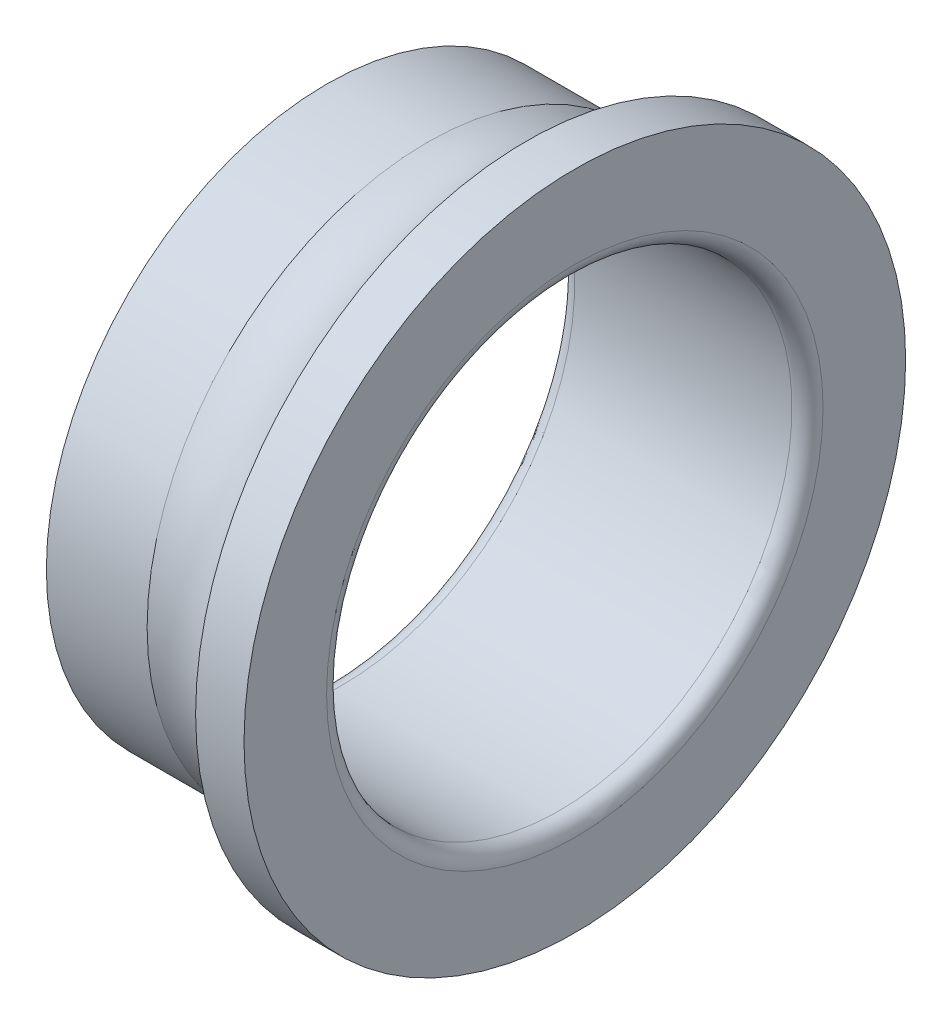
ISO-10303-21;
HEADER;
FILE_DESCRIPTION(('STEP AP214'),'2;1');
FILE_NAME('part.step','',(''),(''),'','','');
FILE_SCHEMA(('AUTOMOTIVE_DESIGN { 1 0 10303 214 1 1 1 1 }'));
ENDSEC;
DATA;
#1=APPLICATION_CONTEXT('core data for automotive mechanical design processes');
#2=APPLICATION_PROTOCOL_DEFINITION('international standard','automotive_design',2000,#1);
#3=PRODUCT_CONTEXT('',#1,'mechanical');
#4=PRODUCT('Part','Part','',(#3));
#5=PRODUCT_RELATED_PRODUCT_CATEGORY('part','',(#4));
#6=PRODUCT_DEFINITION_FORMATION('','',#4);
#7=PRODUCT_DEFINITION_CONTEXT('part definition',#1,'design');
#8=PRODUCT_DEFINITION('design','',#6,#7);
#9=PRODUCT_DEFINITION_SHAPE('','',#8);
#10=(LENGTH_UNIT() NAMED_UNIT(*) SI_UNIT(.MILLI.,.METRE.));
#11=(NAMED_UNIT(*) PLANE_ANGLE_UNIT() SI_UNIT($,.RADIAN.));
#12=(NAMED_UNIT(*) SI_UNIT($,.STERADIAN.) SOLID_ANGLE_UNIT());
#13=UNCERTAINTY_MEASURE_WITH_UNIT(LENGTH_MEASURE(1.E-05),#10,'distance_accuracy_value','');
#14=(GEOMETRIC_REPRESENTATION_CONTEXT(3) GLOBAL_UNCERTAINTY_ASSIGNED_CONTEXT((#13)) GLOBAL_UNIT_ASSIGNED_CONTEXT((#10,
#11,#12)) REPRESENTATION_CONTEXT('',''));
#15=CARTESIAN_POINT('',(0.,0.,0.));
#16=DIRECTION('',(0.,0.,1.));
#17=DIRECTION('',(1.,0.,0.));
#18=AXIS2_PLACEMENT_3D('',#15,#16,#17);
#19=CARTESIAN_POINT('',(0.,-18.4005816497134,-18.065));
#20=DIRECTION('',(-1.,0.,0.));
#21=DIRECTION('',(0.,0.,1.));
#22=AXIS2_PLACEMENT_3D('',#19,#20,#21);
#23=PLANE('',#22);
#24=CARTESIAN_POINT('',(0.,0.,0.));
#25=DIRECTION('',(-1.,0.,0.));
#26=DIRECTION('',(0.,0.,-1.));
#27=AXIS2_PLACEMENT_3D('',#24,#25,#26);
#28=CIRCLE('',#27,18.065);
#29=CARTESIAN_POINT('',(0.,0.,-18.065));
#30=VERTEX_POINT('',#29);
#31=EDGE_CURVE('E43',#30,#30,#28,.F.);
#32=ORIENTED_EDGE('',*,*,#31,.F.);
#33=EDGE_LOOP('',(#32));
#34=FACE_BOUND('',#33,.T.);
#35=CARTESIAN_POINT('',(0.,0.,0.));
#36=DIRECTION('',(1.,0.,0.));
#37=DIRECTION('',(0.,0.,1.));
#38=AXIS2_PLACEMENT_3D('',#35,#36,#37);
#39=CIRCLE('',#38,15.9999999999992);
#40=CARTESIAN_POINT('',(0.,0.,15.9999999999992));
#41=VERTEX_POINT('',#40);
#42=EDGE_CURVE('E40',#41,#41,#39,.T.);
#43=ORIENTED_EDGE('',*,*,#42,.T.);
#44=EDGE_LOOP('',(#43));
#45=FACE_BOUND('',#44,.T.);
#46=ADVANCED_FACE('F14',(#34,#45),#23,.T.);
#47=CARTESIAN_POINT('',(16.,-21.7211404932159,21.325));
#48=DIRECTION('',(1.,0.,0.));
#49=DIRECTION('',(0.,0.,-1.));
#50=AXIS2_PLACEMENT_3D('',#47,#48,#49);
#51=PLANE('',#50);
#52=CARTESIAN_POINT('',(16.,0.,0.));
#53=DIRECTION('',(1.,0.,0.));
#54=DIRECTION('',(0.,-1.16844179766066E-09,1.));
#55=AXIS2_PLACEMENT_3D('',#52,#53,#54);
#56=CIRCLE('',#55,21.325);
#57=CARTESIAN_POINT('',(16.,-2.49170213351135E-08,21.325));
#58=VERTEX_POINT('',#57);
#59=EDGE_CURVE('E37',#58,#58,#56,.T.);
#60=ORIENTED_EDGE('',*,*,#59,.T.);
#61=EDGE_LOOP('',(#60));
#62=FACE_BOUND('',#61,.T.);
#63=CARTESIAN_POINT('',(16.,0.,0.));
#64=DIRECTION('',(-1.,0.,0.));
#65=DIRECTION('',(0.,0.,-1.));
#66=AXIS2_PLACEMENT_3D('',#63,#64,#65);
#67=CIRCLE('',#66,16.0000000394232);
#68=CARTESIAN_POINT('',(16.,0.,-16.0000000394232));
#69=VERTEX_POINT('',#68);
#70=EDGE_CURVE('E34',#69,#69,#67,.F.);
#71=ORIENTED_EDGE('',*,*,#70,.F.);
#72=EDGE_LOOP('',(#71));
#73=FACE_BOUND('',#72,.T.);
#74=ADVANCED_FACE('F52',(#62,#73),#51,.T.);
#75=CARTESIAN_POINT('',(16.,0.,0.));
#76=DIRECTION('',(1.,0.,0.));
#77=DIRECTION('',(0.,1.92343596945729E-10,1.));
#78=AXIS2_PLACEMENT_3D('',#75,#76,#77);
#79=CYLINDRICAL_SURFACE('',#78,18.065);
#80=ORIENTED_EDGE('',*,*,#31,.T.);
#81=EDGE_LOOP('',(#80));
#82=FACE_BOUND('',#81,.T.);
#83=CARTESIAN_POINT('',(6.4946046200416,0.,0.));
#84=DIRECTION('',(-1.,0.,0.));
#85=DIRECTION('',(0.,0.,-1.));
#86=AXIS2_PLACEMENT_3D('',#83,#84,#85);
#87=CIRCLE('',#86,18.065);
#88=CARTESIAN_POINT('',(6.4946046200416,0.,-18.065));
#89=VERTEX_POINT('',#88);
#90=EDGE_CURVE('E29',#89,#89,#87,.F.);
#91=ORIENTED_EDGE('',*,*,#90,.F.);
#92=EDGE_LOOP('',(#91));
#93=FACE_BOUND('',#92,.T.);
#94=ADVANCED_FACE('F47',(#82,#93),#79,.T.);
#95=CARTESIAN_POINT('',(0.999999999999222,0.,0.));
#96=DIRECTION('',(1.,0.,0.));
#97=DIRECTION('',(0.,0.,1.));
#98=AXIS2_PLACEMENT_3D('',#95,#96,#97);
#99=TOROIDAL_SURFACE('',#98,15.9999999999992,0.999999999999222);
#100=CARTESIAN_POINT('',(1.,0.,0.));
#101=DIRECTION('',(1.,0.,0.));
#102=DIRECTION('',(0.,0.,1.));
#103=AXIS2_PLACEMENT_3D('',#100,#101,#102);
#104=CIRCLE('',#103,15.);
#105=CARTESIAN_POINT('',(1.,0.,15.));
#106=VERTEX_POINT('',#105);
#107=EDGE_CURVE('E25',#106,#106,#104,.T.);
#108=ORIENTED_EDGE('',*,*,#107,.T.);
#109=EDGE_LOOP('',(#108));
#110=FACE_BOUND('',#109,.T.);
#111=ORIENTED_EDGE('',*,*,#42,.F.);
#112=EDGE_LOOP('',(#111));
#113=FACE_BOUND('',#112,.T.);
#114=ADVANCED_FACE('F56',(#110,#113),#99,.T.);
#115=CARTESIAN_POINT('',(16.,0.,0.));
#116=DIRECTION('',(1.,0.,0.));
#117=DIRECTION('',(0.,0.,1.));
#118=AXIS2_PLACEMENT_3D('',#115,#116,#117);
#119=CYLINDRICAL_SURFACE('',#118,15.);
#120=CARTESIAN_POINT('',(15.,0.,0.));
#121=DIRECTION('',(1.,0.,0.));
#122=DIRECTION('',(0.,0.,1.));
#123=AXIS2_PLACEMENT_3D('',#120,#121,#122);
#124=CIRCLE('',#123,15.);
#125=CARTESIAN_POINT('',(15.,0.,15.));
#126=VERTEX_POINT('',#125);
#127=EDGE_CURVE('E21',#126,#126,#124,.T.);
#128=ORIENTED_EDGE('',*,*,#127,.T.);
#129=EDGE_LOOP('',(#128));
#130=FACE_BOUND('',#129,.T.);
#131=ORIENTED_EDGE('',*,*,#107,.F.);
#132=EDGE_LOOP('',(#131));
#133=FACE_BOUND('',#132,.T.);
#134=ADVANCED_FACE('F58',(#130,#133),#119,.F.);
#135=CARTESIAN_POINT('',(15.0000000000016,0.,0.));
#136=DIRECTION('',(1.,0.,0.));
#137=DIRECTION('',(0.,0.,1.));
#138=AXIS2_PLACEMENT_3D('',#135,#136,#137);
#139=TOROIDAL_SURFACE('',#138,15.9999999999984,0.99999999999845);
#140=ORIENTED_EDGE('',*,*,#70,.T.);
#141=EDGE_LOOP('',(#140));
#142=FACE_BOUND('',#141,.T.);
#143=ORIENTED_EDGE('',*,*,#127,.F.);
#144=EDGE_LOOP('',(#143));
#145=FACE_BOUND('',#144,.T.);
#146=ADVANCED_FACE('F66',(#142,#145),#139,.T.);
#147=CARTESIAN_POINT('',(16.,0.,0.));
#148=DIRECTION('',(1.,0.,0.));
#149=DIRECTION('',(0.,0.,1.));
#150=AXIS2_PLACEMENT_3D('',#147,#148,#149);
#151=CYLINDRICAL_SURFACE('',#150,21.325);
#152=CARTESIAN_POINT('',(12.880042545921,0.,0.));
#153=DIRECTION('',(1.,0.,0.));
#154=DIRECTION('',(0.,0.,1.));
#155=AXIS2_PLACEMENT_3D('',#152,#153,#154);
#156=CIRCLE('',#155,21.325);
#157=CARTESIAN_POINT('',(12.880042545921,0.,21.325));
#158=VERTEX_POINT('',#157);
#159=EDGE_CURVE('E10',#158,#158,#156,.T.);
#160=ORIENTED_EDGE('',*,*,#159,.T.);
#161=EDGE_LOOP('',(#160));
#162=FACE_BOUND('',#161,.T.);
#163=ORIENTED_EDGE('',*,*,#59,.F.);
#164=EDGE_LOOP('',(#163));
#165=FACE_BOUND('',#164,.T.);
#166=ADVANCED_FACE('F72',(#162,#165),#151,.T.);
#167=CARTESIAN_POINT('',(7.99999999999976,0.,0.));
#168=DIRECTION('',(1.,0.,0.));
#169=DIRECTION('',(0.,7.69374020388877E-10,1.));
#170=AXIS2_PLACEMENT_3D('',#167,#168,#169);
#171=TOROIDAL_SURFACE('',#170,23.0000000000004,5.15950000000025);
#172=ORIENTED_EDGE('',*,*,#90,.T.);
#173=EDGE_LOOP('',(#172));
#174=FACE_BOUND('',#173,.T.);
#175=ORIENTED_EDGE('',*,*,#159,.F.);
#176=EDGE_LOOP('',(#175));
#177=FACE_BOUND('',#176,.T.);
#178=ADVANCED_FACE('F16',(#174,#177),#171,.F.);
#179=CLOSED_SHELL('',(#46,#74,#94,#114,#134,#146,#166,#178));
#180=MANIFOLD_SOLID_BREP('B1',#179);
#181=ADVANCED_BREP_SHAPE_REPRESENTATION('',(#18,#180),#14);
#182=SHAPE_DEFINITION_REPRESENTATION(#9,#181);
ENDSEC;
END-ISO-10303-21;
